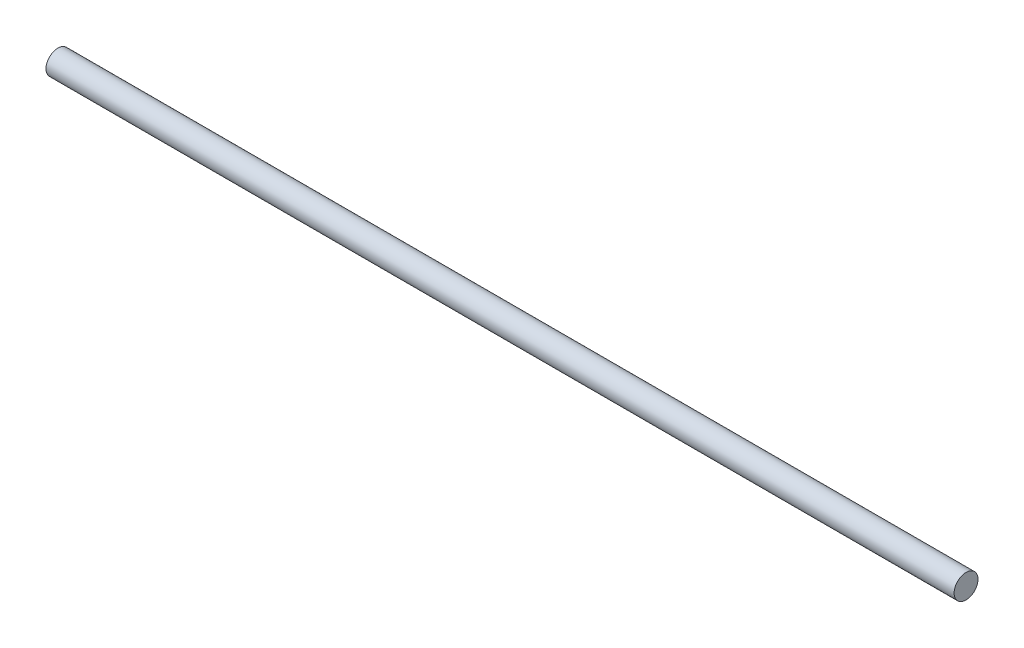
ISO-10303-21;
HEADER;
FILE_DESCRIPTION(('STEP AP214'),'2;1');
FILE_NAME('part.step','',(''),(''),'','','');
FILE_SCHEMA(('AUTOMOTIVE_DESIGN { 1 0 10303 214 1 1 1 1 }'));
ENDSEC;
DATA;
#1=APPLICATION_CONTEXT('core data for automotive mechanical design processes');
#2=APPLICATION_PROTOCOL_DEFINITION('international standard','automotive_design',2000,#1);
#3=PRODUCT_CONTEXT('',#1,'mechanical');
#4=PRODUCT('Part','Part','',(#3));
#5=PRODUCT_RELATED_PRODUCT_CATEGORY('part','',(#4));
#6=PRODUCT_DEFINITION_FORMATION('','',#4);
#7=PRODUCT_DEFINITION_CONTEXT('part definition',#1,'design');
#8=PRODUCT_DEFINITION('design','',#6,#7);
#9=PRODUCT_DEFINITION_SHAPE('','',#8);
#10=(LENGTH_UNIT() NAMED_UNIT(*) SI_UNIT(.MILLI.,.METRE.));
#11=(NAMED_UNIT(*) PLANE_ANGLE_UNIT() SI_UNIT($,.RADIAN.));
#12=(NAMED_UNIT(*) SI_UNIT($,.STERADIAN.) SOLID_ANGLE_UNIT());
#13=UNCERTAINTY_MEASURE_WITH_UNIT(LENGTH_MEASURE(1.E-05),#10,'distance_accuracy_value','');
#14=(GEOMETRIC_REPRESENTATION_CONTEXT(3) GLOBAL_UNCERTAINTY_ASSIGNED_CONTEXT((#13)) GLOBAL_UNIT_ASSIGNED_CONTEXT((#10,
#11,#12)) REPRESENTATION_CONTEXT('',''));
#15=CARTESIAN_POINT('',(0.,0.,0.));
#16=DIRECTION('',(0.,0.,1.));
#17=DIRECTION('',(1.,0.,0.));
#18=AXIS2_PLACEMENT_3D('',#15,#16,#17);
#19=CARTESIAN_POINT('',(152.,0.,0.));
#20=DIRECTION('',(-1.,0.,0.));
#21=DIRECTION('',(0.,0.,1.));
#22=AXIS2_PLACEMENT_3D('',#19,#20,#21);
#23=CYLINDRICAL_SURFACE('',#22,4.);
#24=CARTESIAN_POINT('',(152.,0.,0.));
#25=DIRECTION('',(1.,0.,0.));
#26=DIRECTION('',(0.,0.,-1.));
#27=AXIS2_PLACEMENT_3D('',#24,#25,#26);
#28=CIRCLE('',#27,4.);
#29=CARTESIAN_POINT('',(152.,0.,-4.));
#30=VERTEX_POINT('',#29);
#31=EDGE_CURVE('E10',#30,#30,#28,.T.);
#32=ORIENTED_EDGE('',*,*,#31,.F.);
#33=EDGE_LOOP('',(#32));
#34=FACE_BOUND('',#33,.T.);
#35=CARTESIAN_POINT('',(-152.,0.,0.));
#36=DIRECTION('',(1.,0.,0.));
#37=DIRECTION('',(0.,0.,-1.));
#38=AXIS2_PLACEMENT_3D('',#35,#36,#37);
#39=CIRCLE('',#38,4.);
#40=CARTESIAN_POINT('',(-152.,0.,-4.));
#41=VERTEX_POINT('',#40);
#42=EDGE_CURVE('E33',#41,#41,#39,.T.);
#43=ORIENTED_EDGE('',*,*,#42,.T.);
#44=EDGE_LOOP('',(#43));
#45=FACE_BOUND('',#44,.T.);
#46=ADVANCED_FACE('F30',(#34,#45),#23,.T.);
#47=CARTESIAN_POINT('',(152.,0.,0.));
#48=DIRECTION('',(1.,0.,0.));
#49=DIRECTION('',(0.,0.,-1.));
#50=AXIS2_PLACEMENT_3D('',#47,#48,#49);
#51=PLANE('',#50);
#52=ORIENTED_EDGE('',*,*,#31,.T.);
#53=EDGE_LOOP('',(#52));
#54=FACE_BOUND('',#53,.T.);
#55=ADVANCED_FACE('F45',(#54),#51,.T.);
#56=CARTESIAN_POINT('',(-152.,0.,0.));
#57=DIRECTION('',(1.,0.,0.));
#58=DIRECTION('',(0.,0.,-1.));
#59=AXIS2_PLACEMENT_3D('',#56,#57,#58);
#60=PLANE('',#59);
#61=ORIENTED_EDGE('',*,*,#42,.F.);
#62=EDGE_LOOP('',(#61));
#63=FACE_BOUND('',#62,.T.);
#64=ADVANCED_FACE('F43',(#63),#60,.F.);
#65=CLOSED_SHELL('',(#46,#55,#64));
#66=MANIFOLD_SOLID_BREP('B2',#65);
#67=ADVANCED_BREP_SHAPE_REPRESENTATION('',(#18,#66),#14);
#68=SHAPE_DEFINITION_REPRESENTATION(#9,#67);
ENDSEC;
END-ISO-10303-21;
